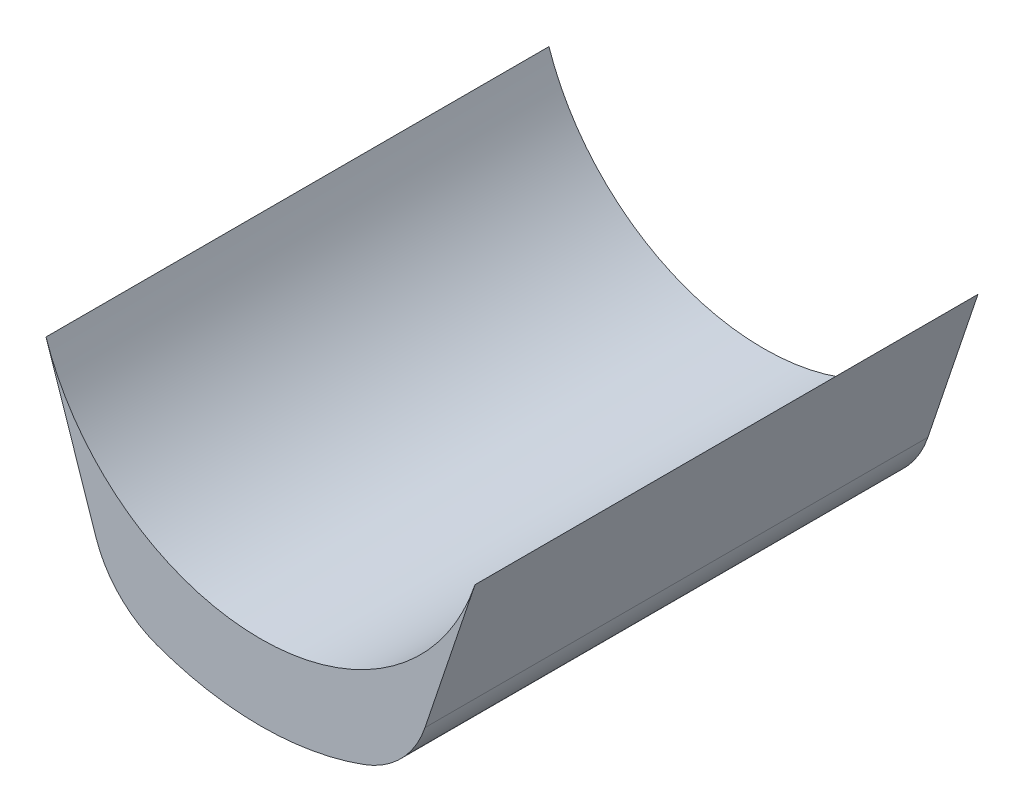
ISO-10303-21;
HEADER;
FILE_DESCRIPTION(('STEP AP214'),'2;1');
FILE_NAME('part.step','',(''),(''),'','','');
FILE_SCHEMA(('AUTOMOTIVE_DESIGN { 1 0 10303 214 1 1 1 1 }'));
ENDSEC;
DATA;
#1=APPLICATION_CONTEXT('core data for automotive mechanical design processes');
#2=APPLICATION_PROTOCOL_DEFINITION('international standard','automotive_design',2000,#1);
#3=PRODUCT_CONTEXT('',#1,'mechanical');
#4=PRODUCT('Part','Part','',(#3));
#5=PRODUCT_RELATED_PRODUCT_CATEGORY('part','',(#4));
#6=PRODUCT_DEFINITION_FORMATION('','',#4);
#7=PRODUCT_DEFINITION_CONTEXT('part definition',#1,'design');
#8=PRODUCT_DEFINITION('design','',#6,#7);
#9=PRODUCT_DEFINITION_SHAPE('','',#8);
#10=(LENGTH_UNIT() NAMED_UNIT(*) SI_UNIT(.MILLI.,.METRE.));
#11=(NAMED_UNIT(*) PLANE_ANGLE_UNIT() SI_UNIT($,.RADIAN.));
#12=(NAMED_UNIT(*) SI_UNIT($,.STERADIAN.) SOLID_ANGLE_UNIT());
#13=UNCERTAINTY_MEASURE_WITH_UNIT(LENGTH_MEASURE(1.E-05),#10,'distance_accuracy_value','');
#14=(GEOMETRIC_REPRESENTATION_CONTEXT(3) GLOBAL_UNCERTAINTY_ASSIGNED_CONTEXT((#13)) GLOBAL_UNIT_ASSIGNED_CONTEXT((#10,
#11,#12)) REPRESENTATION_CONTEXT('',''));
#15=CARTESIAN_POINT('',(0.,0.,0.));
#16=DIRECTION('',(0.,0.,1.));
#17=DIRECTION('',(1.,0.,0.));
#18=AXIS2_PLACEMENT_3D('',#15,#16,#17);
#19=CARTESIAN_POINT('',(0.,0.,127.));
#20=DIRECTION('',(0.,0.,-1.));
#21=DIRECTION('',(-1.,0.,0.));
#22=AXIS2_PLACEMENT_3D('',#19,#20,#21);
#23=CYLINDRICAL_SURFACE('',#22,57.15);
#24=CARTESIAN_POINT('',(0.,0.,0.));
#25=DIRECTION('',(0.,0.,-1.));
#26=DIRECTION('',(1.,0.,0.));
#27=AXIS2_PLACEMENT_3D('',#24,#25,#26);
#28=CIRCLE('',#27,57.15);
#29=CARTESIAN_POINT('',(54.1680251208408,-18.2194279412928,0.));
#30=VERTEX_POINT('',#29);
#31=CARTESIAN_POINT('',(-54.1680251208408,-18.2194279412928,0.));
#32=VERTEX_POINT('',#31);
#33=EDGE_CURVE('E114',#30,#32,#28,.T.);
#34=ORIENTED_EDGE('',*,*,#33,.T.);
#35=DIRECTION('',(0.,0.,-1.));
#36=VECTOR('',#35,1.);
#37=CARTESIAN_POINT('',(-54.1680251208408,-18.2194279412928,127.));
#38=LINE('',#37,#36);
#39=CARTESIAN_POINT('',(-54.1680251208408,-18.2194279412928,127.));
#40=VERTEX_POINT('',#39);
#41=EDGE_CURVE('E97',#40,#32,#38,.T.);
#42=ORIENTED_EDGE('',*,*,#41,.F.);
#43=CARTESIAN_POINT('',(0.,0.,127.));
#44=DIRECTION('',(0.,0.,-1.));
#45=DIRECTION('',(1.,0.,0.));
#46=AXIS2_PLACEMENT_3D('',#43,#44,#45);
#47=CIRCLE('',#46,57.15);
#48=CARTESIAN_POINT('',(54.1680251208408,-18.2194279412928,127.));
#49=VERTEX_POINT('',#48);
#50=EDGE_CURVE('E102',#49,#40,#47,.T.);
#51=ORIENTED_EDGE('',*,*,#50,.F.);
#52=DIRECTION('',(0.,0.,-1.));
#53=VECTOR('',#52,1.);
#54=CARTESIAN_POINT('',(54.1680251208408,-18.2194279412928,127.));
#55=LINE('',#54,#53);
#56=EDGE_CURVE('E117',#49,#30,#55,.T.);
#57=ORIENTED_EDGE('',*,*,#56,.T.);
#58=EDGE_LOOP('',(#34,#42,#51,#57));
#59=FACE_BOUND('',#58,.T.);
#60=ADVANCED_FACE('F39',(#59),#23,.F.);
#61=CARTESIAN_POINT('',(-54.1680251208408,-18.2194279412928,127.));
#62=DIRECTION('',(0.94782196186948,0.318800138955255,0.));
#63=DIRECTION('',(-0.318800138955256,0.94782196186948,0.));
#64=AXIS2_PLACEMENT_3D('',#61,#62,#63);
#65=PLANE('',#64);
#66=DIRECTION('',(0.318800138955255,-0.94782196186948,0.));
#67=VECTOR('',#66,1.);
#68=CARTESIAN_POINT('',(-54.1680251208408,-18.2194279412928,0.));
#69=LINE('',#68,#67);
#70=CARTESIAN_POINT('',(-41.52577056247,-55.80600665872,0.));
#71=VERTEX_POINT('',#70);
#72=EDGE_CURVE('E152',#32,#71,#69,.T.);
#73=ORIENTED_EDGE('',*,*,#72,.T.);
#74=DIRECTION('',(0.,0.,-1.));
#75=VECTOR('',#74,1.);
#76=CARTESIAN_POINT('',(-41.5257705624699,-55.80600665872,127.));
#77=LINE('',#76,#75);
#78=CARTESIAN_POINT('',(-41.52577056247,-55.80600665872,127.));
#79=VERTEX_POINT('',#78);
#80=EDGE_CURVE('E63',#71,#79,#77,.F.);
#81=ORIENTED_EDGE('',*,*,#80,.T.);
#82=DIRECTION('',(0.318800138955255,-0.94782196186948,0.));
#83=VECTOR('',#82,1.);
#84=CARTESIAN_POINT('',(-54.1680251208408,-18.2194279412928,127.));
#85=LINE('',#84,#83);
#86=EDGE_CURVE('E93',#40,#79,#85,.T.);
#87=ORIENTED_EDGE('',*,*,#86,.F.);
#88=ORIENTED_EDGE('',*,*,#41,.T.);
#89=EDGE_LOOP('',(#73,#81,#87,#88));
#90=FACE_BOUND('',#89,.T.);
#91=ADVANCED_FACE('F95',(#90),#65,.F.);
#92=CARTESIAN_POINT('',(0.,0.,127.));
#93=DIRECTION('',(0.,0.,-1.));
#94=DIRECTION('',(-1.,0.,0.));
#95=AXIS2_PLACEMENT_3D('',#92,#93,#94);
#96=CYLINDRICAL_SURFACE('',#95,76.2);
#97=CARTESIAN_POINT('',(0.,0.,127.));
#98=DIRECTION('',(0.,0.,1.));
#99=DIRECTION('',(1.,0.,0.));
#100=AXIS2_PLACEMENT_3D('',#97,#98,#99);
#101=CIRCLE('',#100,76.2);
#102=CARTESIAN_POINT('',(-26.1766390964777,-71.5627246938848,127.));
#103=VERTEX_POINT('',#102);
#104=CARTESIAN_POINT('',(26.1766390964778,-71.5627246938848,127.));
#105=VERTEX_POINT('',#104);
#106=EDGE_CURVE('E101',#103,#105,#101,.T.);
#107=ORIENTED_EDGE('',*,*,#106,.F.);
#108=DIRECTION('',(0.,0.,-1.));
#109=VECTOR('',#108,1.);
#110=CARTESIAN_POINT('',(-26.1766390964777,-71.5627246938848,127.));
#111=LINE('',#110,#109);
#112=CARTESIAN_POINT('',(-26.1766390964777,-71.5627246938848,0.));
#113=VERTEX_POINT('',#112);
#114=EDGE_CURVE('E121',#103,#113,#111,.T.);
#115=ORIENTED_EDGE('',*,*,#114,.T.);
#116=CARTESIAN_POINT('',(0.,0.,0.));
#117=DIRECTION('',(0.,0.,1.));
#118=DIRECTION('',(1.,0.,0.));
#119=AXIS2_PLACEMENT_3D('',#116,#117,#118);
#120=CIRCLE('',#119,76.2);
#121=CARTESIAN_POINT('',(26.1766390964778,-71.5627246938848,0.));
#122=VERTEX_POINT('',#121);
#123=EDGE_CURVE('E153',#113,#122,#120,.T.);
#124=ORIENTED_EDGE('',*,*,#123,.T.);
#125=DIRECTION('',(0.,0.,-1.));
#126=VECTOR('',#125,1.);
#127=CARTESIAN_POINT('',(26.1766390964778,-71.5627246938848,127.));
#128=LINE('',#127,#126);
#129=EDGE_CURVE('E116',#122,#105,#128,.F.);
#130=ORIENTED_EDGE('',*,*,#129,.T.);
#131=EDGE_LOOP('',(#107,#115,#124,#130));
#132=FACE_BOUND('',#131,.T.);
#133=ADVANCED_FACE('F143',(#132),#96,.T.);
#134=CARTESIAN_POINT('',(54.1680251208408,-18.2194279412928,127.));
#135=DIRECTION('',(-0.94782196186948,0.318800138955255,0.));
#136=DIRECTION('',(-0.318800138955255,-0.94782196186948,0.));
#137=AXIS2_PLACEMENT_3D('',#134,#135,#136);
#138=PLANE('',#137);
#139=DIRECTION('',(0.318800138955255,0.94782196186948,0.));
#140=VECTOR('',#139,1.);
#141=CARTESIAN_POINT('',(54.1680251208408,-18.2194279412928,127.));
#142=LINE('',#141,#140);
#143=CARTESIAN_POINT('',(41.52577056247,-55.80600665872,127.));
#144=VERTEX_POINT('',#143);
#145=EDGE_CURVE('E106',#144,#49,#142,.T.);
#146=ORIENTED_EDGE('',*,*,#145,.F.);
#147=DIRECTION('',(0.,0.,-1.));
#148=VECTOR('',#147,1.);
#149=CARTESIAN_POINT('',(41.52577056247,-55.80600665872,127.));
#150=LINE('',#149,#148);
#151=CARTESIAN_POINT('',(41.52577056247,-55.80600665872,0.));
#152=VERTEX_POINT('',#151);
#153=EDGE_CURVE('E11',#144,#152,#150,.T.);
#154=ORIENTED_EDGE('',*,*,#153,.T.);
#155=DIRECTION('',(0.318800138955255,0.94782196186948,0.));
#156=VECTOR('',#155,1.);
#157=CARTESIAN_POINT('',(54.1680251208408,-18.2194279412928,0.));
#158=LINE('',#157,#156);
#159=EDGE_CURVE('E111',#152,#30,#158,.T.);
#160=ORIENTED_EDGE('',*,*,#159,.T.);
#161=ORIENTED_EDGE('',*,*,#56,.F.);
#162=EDGE_LOOP('',(#146,#154,#160,#161));
#163=FACE_BOUND('',#162,.T.);
#164=ADVANCED_FACE('F164',(#163),#138,.F.);
#165=CARTESIAN_POINT('',(0.,0.,127.));
#166=DIRECTION('',(0.,0.,1.));
#167=DIRECTION('',(1.,0.,0.));
#168=AXIS2_PLACEMENT_3D('',#165,#166,#167);
#169=PLANE('',#168);
#170=ORIENTED_EDGE('',*,*,#86,.T.);
#171=CARTESIAN_POINT('',(-17.4510927309852,-47.7084831292565,127.));
#172=DIRECTION('',(0.,0.,1.));
#173=DIRECTION('',(1.,0.,0.));
#174=AXIS2_PLACEMENT_3D('',#171,#172,#173);
#175=CIRCLE('',#174,25.4);
#176=EDGE_CURVE('E48',#79,#103,#175,.T.);
#177=ORIENTED_EDGE('',*,*,#176,.T.);
#178=ORIENTED_EDGE('',*,*,#106,.T.);
#179=CARTESIAN_POINT('',(17.4510927309852,-47.7084831292565,127.));
#180=DIRECTION('',(0.,0.,1.));
#181=DIRECTION('',(1.,0.,0.));
#182=AXIS2_PLACEMENT_3D('',#179,#180,#181);
#183=CIRCLE('',#182,25.4);
#184=EDGE_CURVE('E55',#105,#144,#183,.T.);
#185=ORIENTED_EDGE('',*,*,#184,.T.);
#186=ORIENTED_EDGE('',*,*,#145,.T.);
#187=ORIENTED_EDGE('',*,*,#50,.T.);
#188=EDGE_LOOP('',(#170,#177,#178,#185,#186,#187));
#189=FACE_BOUND('',#188,.T.);
#190=ADVANCED_FACE('F105',(#189),#169,.T.);
#191=CARTESIAN_POINT('',(0.,0.,0.));
#192=DIRECTION('',(0.,0.,1.));
#193=DIRECTION('',(1.,0.,0.));
#194=AXIS2_PLACEMENT_3D('',#191,#192,#193);
#195=PLANE('',#194);
#196=ORIENTED_EDGE('',*,*,#123,.F.);
#197=CARTESIAN_POINT('',(-17.4510927309852,-47.7084831292565,0.));
#198=DIRECTION('',(0.,0.,1.));
#199=DIRECTION('',(1.,0.,0.));
#200=AXIS2_PLACEMENT_3D('',#197,#198,#199);
#201=CIRCLE('',#200,25.4);
#202=EDGE_CURVE('E132',#113,#71,#201,.F.);
#203=ORIENTED_EDGE('',*,*,#202,.T.);
#204=ORIENTED_EDGE('',*,*,#72,.F.);
#205=ORIENTED_EDGE('',*,*,#33,.F.);
#206=ORIENTED_EDGE('',*,*,#159,.F.);
#207=CARTESIAN_POINT('',(17.4510927309852,-47.7084831292565,0.));
#208=DIRECTION('',(0.,0.,1.));
#209=DIRECTION('',(1.,0.,0.));
#210=AXIS2_PLACEMENT_3D('',#207,#208,#209);
#211=CIRCLE('',#210,25.4);
#212=EDGE_CURVE('E129',#152,#122,#211,.F.);
#213=ORIENTED_EDGE('',*,*,#212,.T.);
#214=EDGE_LOOP('',(#196,#203,#204,#205,#206,#213));
#215=FACE_BOUND('',#214,.T.);
#216=ADVANCED_FACE('F151',(#215),#195,.F.);
#217=CARTESIAN_POINT('',(-17.4510927309852,-47.7084831292565,127.));
#218=DIRECTION('',(0.,0.,-1.));
#219=DIRECTION('',(-1.,0.,0.));
#220=AXIS2_PLACEMENT_3D('',#217,#218,#219);
#221=CYLINDRICAL_SURFACE('',#220,25.4);
#222=ORIENTED_EDGE('',*,*,#176,.F.);
#223=ORIENTED_EDGE('',*,*,#80,.F.);
#224=ORIENTED_EDGE('',*,*,#202,.F.);
#225=ORIENTED_EDGE('',*,*,#114,.F.);
#226=EDGE_LOOP('',(#222,#223,#224,#225));
#227=FACE_BOUND('',#226,.T.);
#228=ADVANCED_FACE('F149',(#227),#221,.T.);
#229=CARTESIAN_POINT('',(17.4510927309852,-47.7084831292565,127.));
#230=DIRECTION('',(0.,0.,-1.));
#231=DIRECTION('',(-1.,0.,0.));
#232=AXIS2_PLACEMENT_3D('',#229,#230,#231);
#233=CYLINDRICAL_SURFACE('',#232,25.4);
#234=ORIENTED_EDGE('',*,*,#184,.F.);
#235=ORIENTED_EDGE('',*,*,#129,.F.);
#236=ORIENTED_EDGE('',*,*,#212,.F.);
#237=ORIENTED_EDGE('',*,*,#153,.F.);
#238=EDGE_LOOP('',(#234,#235,#236,#237));
#239=FACE_BOUND('',#238,.T.);
#240=ADVANCED_FACE('F41',(#239),#233,.T.);
#241=CLOSED_SHELL('',(#60,#91,#133,#164,#190,#216,#228,#240));
#242=MANIFOLD_SOLID_BREP('B2',#241);
#243=ADVANCED_BREP_SHAPE_REPRESENTATION('',(#18,#242),#14);
#244=SHAPE_DEFINITION_REPRESENTATION(#9,#243);
ENDSEC;
END-ISO-10303-21;
